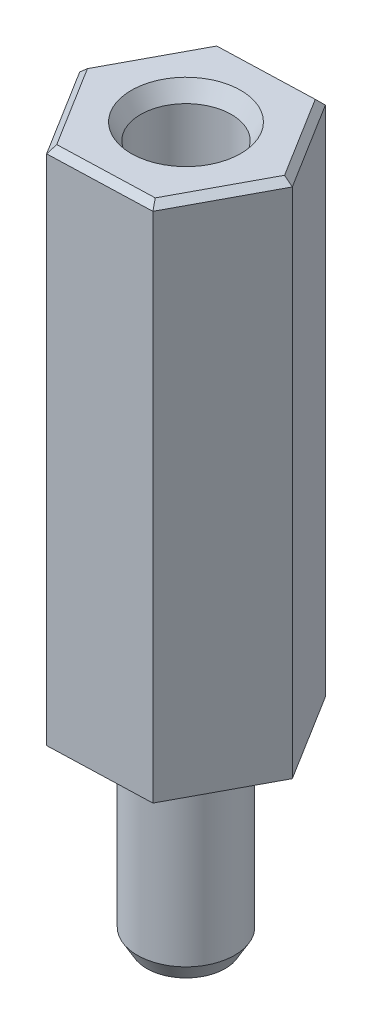
ISO-10303-21;
HEADER;
FILE_DESCRIPTION(('STEP AP214'),'2;1');
FILE_NAME('part.step','',(''),(''),'','','');
FILE_SCHEMA(('AUTOMOTIVE_DESIGN { 1 0 10303 214 1 1 1 1 }'));
ENDSEC;
DATA;
#1=APPLICATION_CONTEXT('core data for automotive mechanical design processes');
#2=APPLICATION_PROTOCOL_DEFINITION('international standard','automotive_design',2000,#1);
#3=PRODUCT_CONTEXT('',#1,'mechanical');
#4=PRODUCT('Part','Part','',(#3));
#5=PRODUCT_RELATED_PRODUCT_CATEGORY('part','',(#4));
#6=PRODUCT_DEFINITION_FORMATION('','',#4);
#7=PRODUCT_DEFINITION_CONTEXT('part definition',#1,'design');
#8=PRODUCT_DEFINITION('design','',#6,#7);
#9=PRODUCT_DEFINITION_SHAPE('','',#8);
#10=(LENGTH_UNIT() NAMED_UNIT(*) SI_UNIT(.MILLI.,.METRE.));
#11=(NAMED_UNIT(*) PLANE_ANGLE_UNIT() SI_UNIT($,.RADIAN.));
#12=(NAMED_UNIT(*) SI_UNIT($,.STERADIAN.) SOLID_ANGLE_UNIT());
#13=UNCERTAINTY_MEASURE_WITH_UNIT(LENGTH_MEASURE(1.E-05),#10,'distance_accuracy_value','');
#14=(GEOMETRIC_REPRESENTATION_CONTEXT(3) GLOBAL_UNCERTAINTY_ASSIGNED_CONTEXT((#13)) GLOBAL_UNIT_ASSIGNED_CONTEXT((#10,
#11,#12)) REPRESENTATION_CONTEXT('',''));
#15=CARTESIAN_POINT('',(0.,0.,0.));
#16=DIRECTION('',(0.,0.,1.));
#17=DIRECTION('',(1.,0.,0.));
#18=AXIS2_PLACEMENT_3D('',#15,#16,#17);
#19=CARTESIAN_POINT('',(3.17374881746763,16.,-0.103207446224368));
#20=DIRECTION('',(-0.849316901074805,0.,0.527883321908062));
#21=DIRECTION('',(0.527883321908062,0.,0.849316901074805));
#22=AXIS2_PLACEMENT_3D('',#19,#20,#21);
#23=PLANE('',#22);
#24=DIRECTION('',(0.,-1.,0.));
#25=VECTOR('',#24,1.);
#26=CARTESIAN_POINT('',(1.4974941384438,16.,-2.80015082426997));
#27=LINE('',#26,#25);
#28=CARTESIAN_POINT('',(1.4974941384438,15.8,-2.80015082426997));
#29=VERTEX_POINT('',#28);
#30=CARTESIAN_POINT('',(1.4974941384438,0.,-2.80015082426997));
#31=VERTEX_POINT('',#30);
#32=EDGE_CURVE('E117',#29,#31,#27,.T.);
#33=ORIENTED_EDGE('',*,*,#32,.F.);
#34=DIRECTION('',(0.527883321908062,0.,0.849316901074805));
#35=VECTOR('',#34,1.);
#36=CARTESIAN_POINT('',(3.17374881746763,15.8,-0.103207446224368));
#37=LINE('',#36,#35);
#38=CARTESIAN_POINT('',(3.17374881746763,15.8,-0.103207446224368));
#39=VERTEX_POINT('',#38);
#40=EDGE_CURVE('E191',#29,#39,#37,.T.);
#41=ORIENTED_EDGE('',*,*,#40,.T.);
#42=DIRECTION('',(0.,-1.,0.));
#43=VECTOR('',#42,1.);
#44=CARTESIAN_POINT('',(3.17374881746763,16.,-0.103207446224368));
#45=LINE('',#44,#43);
#46=CARTESIAN_POINT('',(3.17374881746763,0.,-0.103207446224368));
#47=VERTEX_POINT('',#46);
#48=EDGE_CURVE('E141',#39,#47,#45,.T.);
#49=ORIENTED_EDGE('',*,*,#48,.T.);
#50=DIRECTION('',(-0.527883321908062,0.,-0.849316901074805));
#51=VECTOR('',#50,1.);
#52=CARTESIAN_POINT('',(3.17374881746763,0.,-0.103207446224368));
#53=LINE('',#52,#51);
#54=EDGE_CURVE('E136',#47,#31,#53,.T.);
#55=ORIENTED_EDGE('',*,*,#54,.T.);
#56=EDGE_LOOP('',(#33,#41,#49,#55));
#57=FACE_BOUND('',#56,.T.);
#58=ADVANCED_FACE('F46',(#57),#23,.F.);
#59=CARTESIAN_POINT('',(1.4974941384438,16.,-2.80015082426997));
#60=DIRECTION('',(0.0325019164690975,0.,0.999471673148287));
#61=DIRECTION('',(0.999471673148287,0.,-0.0325019164690975));
#62=AXIS2_PLACEMENT_3D('',#59,#60,#61);
#63=PLANE('',#62);
#64=DIRECTION('',(0.,-1.,0.));
#65=VECTOR('',#64,1.);
#66=CARTESIAN_POINT('',(-1.67625467902383,16.,-2.69694337804561));
#67=LINE('',#66,#65);
#68=CARTESIAN_POINT('',(-1.67625467902383,15.8,-2.69694337804561));
#69=VERTEX_POINT('',#68);
#70=CARTESIAN_POINT('',(-1.67625467902383,0.,-2.69694337804561));
#71=VERTEX_POINT('',#70);
#72=EDGE_CURVE('E130',#69,#71,#67,.T.);
#73=ORIENTED_EDGE('',*,*,#72,.F.);
#74=DIRECTION('',(0.999471673148287,0.,-0.0325019164690975));
#75=VECTOR('',#74,1.);
#76=CARTESIAN_POINT('',(1.4974941384438,15.8,-2.80015082426997));
#77=LINE('',#76,#75);
#78=EDGE_CURVE('E124',#69,#29,#77,.T.);
#79=ORIENTED_EDGE('',*,*,#78,.T.);
#80=ORIENTED_EDGE('',*,*,#32,.T.);
#81=DIRECTION('',(-0.999471673148287,0.,0.0325019164690975));
#82=VECTOR('',#81,1.);
#83=CARTESIAN_POINT('',(1.4974941384438,0.,-2.80015082426997));
#84=LINE('',#83,#82);
#85=EDGE_CURVE('E121',#31,#71,#84,.T.);
#86=ORIENTED_EDGE('',*,*,#85,.T.);
#87=EDGE_LOOP('',(#73,#79,#80,#86));
#88=FACE_BOUND('',#87,.T.);
#89=ADVANCED_FACE('F120',(#88),#63,.F.);
#90=CARTESIAN_POINT('',(-1.67625467902383,16.,-2.69694337804561));
#91=DIRECTION('',(0.881818817543902,0.,0.471588351240225));
#92=DIRECTION('',(0.471588351240225,0.,-0.881818817543902));
#93=AXIS2_PLACEMENT_3D('',#90,#91,#92);
#94=PLANE('',#93);
#95=DIRECTION('',(0.,-1.,0.));
#96=VECTOR('',#95,1.);
#97=CARTESIAN_POINT('',(-3.17374881746763,16.,0.103207446224368));
#98=LINE('',#97,#96);
#99=CARTESIAN_POINT('',(-3.17374881746763,15.8,0.103207446224368));
#100=VERTEX_POINT('',#99);
#101=CARTESIAN_POINT('',(-3.17374881746763,0.,0.103207446224368));
#102=VERTEX_POINT('',#101);
#103=EDGE_CURVE('E163',#100,#102,#98,.T.);
#104=ORIENTED_EDGE('',*,*,#103,.F.);
#105=DIRECTION('',(0.471588351240225,0.,-0.881818817543902));
#106=VECTOR('',#105,1.);
#107=CARTESIAN_POINT('',(-1.67625467902383,15.8,-2.69694337804561));
#108=LINE('',#107,#106);
#109=EDGE_CURVE('E194',#100,#69,#108,.T.);
#110=ORIENTED_EDGE('',*,*,#109,.T.);
#111=ORIENTED_EDGE('',*,*,#72,.T.);
#112=DIRECTION('',(-0.471588351240225,0.,0.881818817543902));
#113=VECTOR('',#112,1.);
#114=CARTESIAN_POINT('',(-1.67625467902383,0.,-2.69694337804561));
#115=LINE('',#114,#113);
#116=EDGE_CURVE('E139',#71,#102,#115,.T.);
#117=ORIENTED_EDGE('',*,*,#116,.T.);
#118=EDGE_LOOP('',(#104,#110,#111,#117));
#119=FACE_BOUND('',#118,.T.);
#120=ADVANCED_FACE('F227',(#119),#94,.F.);
#121=CARTESIAN_POINT('',(-3.17374881746763,16.,0.103207446224368));
#122=DIRECTION('',(0.849316901074805,0.,-0.527883321908062));
#123=DIRECTION('',(-0.527883321908062,0.,-0.849316901074805));
#124=AXIS2_PLACEMENT_3D('',#121,#122,#123);
#125=PLANE('',#124);
#126=DIRECTION('',(0.,-1.,0.));
#127=VECTOR('',#126,1.);
#128=CARTESIAN_POINT('',(-1.49749413844379,16.,2.80015082426997));
#129=LINE('',#128,#127);
#130=CARTESIAN_POINT('',(-1.49749413844379,15.8,2.80015082426997));
#131=VERTEX_POINT('',#130);
#132=CARTESIAN_POINT('',(-1.49749413844379,0.,2.80015082426997));
#133=VERTEX_POINT('',#132);
#134=EDGE_CURVE('E161',#131,#133,#129,.T.);
#135=ORIENTED_EDGE('',*,*,#134,.F.);
#136=DIRECTION('',(-0.527883321908062,0.,-0.849316901074805));
#137=VECTOR('',#136,1.);
#138=CARTESIAN_POINT('',(-3.17374881746763,15.8,0.103207446224368));
#139=LINE('',#138,#137);
#140=EDGE_CURVE('E196',#131,#100,#139,.T.);
#141=ORIENTED_EDGE('',*,*,#140,.T.);
#142=ORIENTED_EDGE('',*,*,#103,.T.);
#143=DIRECTION('',(0.527883321908062,0.,0.849316901074805));
#144=VECTOR('',#143,1.);
#145=CARTESIAN_POINT('',(-3.17374881746763,0.,0.103207446224368));
#146=LINE('',#145,#144);
#147=EDGE_CURVE('E150',#102,#133,#146,.T.);
#148=ORIENTED_EDGE('',*,*,#147,.T.);
#149=EDGE_LOOP('',(#135,#141,#142,#148));
#150=FACE_BOUND('',#149,.T.);
#151=ADVANCED_FACE('F225',(#150),#125,.F.);
#152=CARTESIAN_POINT('',(-1.49749413844379,16.,2.80015082426997));
#153=DIRECTION('',(-0.0325019164690977,0.,-0.999471673148287));
#154=DIRECTION('',(-0.999471673148287,0.,0.0325019164690977));
#155=AXIS2_PLACEMENT_3D('',#152,#153,#154);
#156=PLANE('',#155);
#157=DIRECTION('',(0.,-1.,0.));
#158=VECTOR('',#157,1.);
#159=CARTESIAN_POINT('',(1.67625467902383,16.,2.69694337804561));
#160=LINE('',#159,#158);
#161=CARTESIAN_POINT('',(1.67625467902383,15.8,2.69694337804561));
#162=VERTEX_POINT('',#161);
#163=CARTESIAN_POINT('',(1.67625467902383,0.,2.69694337804561));
#164=VERTEX_POINT('',#163);
#165=EDGE_CURVE('E159',#162,#164,#160,.T.);
#166=ORIENTED_EDGE('',*,*,#165,.F.);
#167=DIRECTION('',(-0.999471673148287,0.,0.0325019164690977));
#168=VECTOR('',#167,1.);
#169=CARTESIAN_POINT('',(-1.49749413844379,15.8,2.80015082426997));
#170=LINE('',#169,#168);
#171=EDGE_CURVE('E55',#162,#131,#170,.T.);
#172=ORIENTED_EDGE('',*,*,#171,.T.);
#173=ORIENTED_EDGE('',*,*,#134,.T.);
#174=DIRECTION('',(0.999471673148287,0.,-0.0325019164690977));
#175=VECTOR('',#174,1.);
#176=CARTESIAN_POINT('',(-1.49749413844379,0.,2.80015082426997));
#177=LINE('',#176,#175);
#178=EDGE_CURVE('E153',#133,#164,#177,.T.);
#179=ORIENTED_EDGE('',*,*,#178,.T.);
#180=EDGE_LOOP('',(#166,#172,#173,#179));
#181=FACE_BOUND('',#180,.T.);
#182=ADVANCED_FACE('F229',(#181),#156,.F.);
#183=CARTESIAN_POINT('',(1.67625467902383,16.,2.69694337804561));
#184=DIRECTION('',(-0.881818817543902,0.,-0.471588351240225));
#185=DIRECTION('',(-0.471588351240225,0.,0.881818817543902));
#186=AXIS2_PLACEMENT_3D('',#183,#184,#185);
#187=PLANE('',#186);
#188=ORIENTED_EDGE('',*,*,#48,.F.);
#189=DIRECTION('',(-0.471588351240225,0.,0.881818817543902));
#190=VECTOR('',#189,1.);
#191=CARTESIAN_POINT('',(1.67625467902383,15.8,2.69694337804561));
#192=LINE('',#191,#190);
#193=EDGE_CURVE('E13',#39,#162,#192,.T.);
#194=ORIENTED_EDGE('',*,*,#193,.T.);
#195=ORIENTED_EDGE('',*,*,#165,.T.);
#196=DIRECTION('',(0.471588351240225,0.,-0.881818817543902));
#197=VECTOR('',#196,1.);
#198=CARTESIAN_POINT('',(1.67625467902383,0.,2.69694337804561));
#199=LINE('',#198,#197);
#200=EDGE_CURVE('E156',#164,#47,#199,.T.);
#201=ORIENTED_EDGE('',*,*,#200,.T.);
#202=EDGE_LOOP('',(#188,#194,#195,#201));
#203=FACE_BOUND('',#202,.T.);
#204=ADVANCED_FACE('F230',(#203),#187,.F.);
#205=CARTESIAN_POINT('',(0.,16.,0.));
#206=DIRECTION('',(0.,1.,0.));
#207=DIRECTION('',(0.,0.,1.));
#208=AXIS2_PLACEMENT_3D('',#205,#206,#207);
#209=PLANE('',#208);
#210=DIRECTION('',(0.471588351240225,0.,-0.881818817543902));
#211=VECTOR('',#210,1.);
#212=CARTESIAN_POINT('',(2.99738505395885,16.,-0.197525116472412));
#213=LINE('',#212,#211);
#214=CARTESIAN_POINT('',(1.5543452478221,16.,2.50080204146047));
#215=VERTEX_POINT('',#214);
#216=CARTESIAN_POINT('',(2.9429307216518,16.,-0.095701450135322));
#217=VERTEX_POINT('',#216);
#218=EDGE_CURVE('E178',#215,#217,#213,.T.);
#219=ORIENTED_EDGE('',*,*,#218,.T.);
#220=DIRECTION('',(-0.527883321908062,0.,-0.849316901074805));
#221=VECTOR('',#220,1.);
#222=CARTESIAN_POINT('',(1.32763075822884,16.,-2.69457415988836));
#223=LINE('',#222,#221);
#224=CARTESIAN_POINT('',(1.3885854738297,16.,-2.59650349159579));
#225=VERTEX_POINT('',#224);
#226=EDGE_CURVE('E188',#217,#225,#223,.T.);
#227=ORIENTED_EDGE('',*,*,#226,.T.);
#228=DIRECTION('',(-0.999471673148287,0.,0.0325019164690975));
#229=VECTOR('',#228,1.);
#230=CARTESIAN_POINT('',(-1.66975429573001,16.,-2.49704904341595));
#231=LINE('',#230,#229);
#232=CARTESIAN_POINT('',(-1.5543452478221,16.,-2.50080204146047));
#233=VERTEX_POINT('',#232);
#234=EDGE_CURVE('E186',#225,#233,#231,.T.);
#235=ORIENTED_EDGE('',*,*,#234,.T.);
#236=DIRECTION('',(-0.471588351240225,0.,0.881818817543903));
#237=VECTOR('',#236,1.);
#238=CARTESIAN_POINT('',(-2.99738505395885,16.,0.197525116472412));
#239=LINE('',#238,#237);
#240=CARTESIAN_POINT('',(-2.9429307216518,16.,0.095701450135323));
#241=VERTEX_POINT('',#240);
#242=EDGE_CURVE('E184',#233,#241,#239,.T.);
#243=ORIENTED_EDGE('',*,*,#242,.T.);
#244=DIRECTION('',(0.527883321908062,0.,0.849316901074805));
#245=VECTOR('',#244,1.);
#246=CARTESIAN_POINT('',(-1.32763075822884,16.,2.69457415988836));
#247=LINE('',#246,#245);
#248=CARTESIAN_POINT('',(-1.3885854738297,16.,2.59650349159579));
#249=VERTEX_POINT('',#248);
#250=EDGE_CURVE('E182',#241,#249,#247,.T.);
#251=ORIENTED_EDGE('',*,*,#250,.T.);
#252=DIRECTION('',(0.999471673148287,0.,-0.0325019164690977));
#253=VECTOR('',#252,1.);
#254=CARTESIAN_POINT('',(1.66975429573001,16.,2.49704904341595));
#255=LINE('',#254,#253);
#256=EDGE_CURVE('E180',#249,#215,#255,.T.);
#257=ORIENTED_EDGE('',*,*,#256,.T.);
#258=EDGE_LOOP('',(#219,#227,#235,#243,#251,#257));
#259=FACE_BOUND('',#258,.T.);
#260=CARTESIAN_POINT('',(0.,16.,0.));
#261=DIRECTION('',(0.,1.,0.));
#262=DIRECTION('',(0.,0.,1.));
#263=AXIS2_PLACEMENT_3D('',#260,#261,#262);
#264=CIRCLE('',#263,1.68867513459481);
#265=CARTESIAN_POINT('',(0.,16.,1.68867513459481));
#266=VERTEX_POINT('',#265);
#267=EDGE_CURVE('E169',#266,#266,#264,.F.);
#268=ORIENTED_EDGE('',*,*,#267,.T.);
#269=EDGE_LOOP('',(#268));
#270=FACE_BOUND('',#269,.T.);
#271=ADVANCED_FACE('F232',(#259,#270),#209,.T.);
#272=CARTESIAN_POINT('',(0.,0.,0.));
#273=DIRECTION('',(0.,1.,0.));
#274=DIRECTION('',(0.,0.,1.));
#275=AXIS2_PLACEMENT_3D('',#272,#273,#274);
#276=PLANE('',#275);
#277=CARTESIAN_POINT('',(0.,0.,0.));
#278=DIRECTION('',(0.,-1.,0.));
#279=DIRECTION('',(0.,0.,-1.));
#280=AXIS2_PLACEMENT_3D('',#277,#278,#279);
#281=CIRCLE('',#280,1.5);
#282=CARTESIAN_POINT('',(0.,0.,-1.5));
#283=VERTEX_POINT('',#282);
#284=EDGE_CURVE('E129',#283,#283,#281,.T.);
#285=ORIENTED_EDGE('',*,*,#284,.F.);
#286=EDGE_LOOP('',(#285));
#287=FACE_BOUND('',#286,.T.);
#288=ORIENTED_EDGE('',*,*,#54,.F.);
#289=ORIENTED_EDGE('',*,*,#200,.F.);
#290=ORIENTED_EDGE('',*,*,#178,.F.);
#291=ORIENTED_EDGE('',*,*,#147,.F.);
#292=ORIENTED_EDGE('',*,*,#116,.F.);
#293=ORIENTED_EDGE('',*,*,#85,.F.);
#294=EDGE_LOOP('',(#288,#289,#290,#291,#292,#293));
#295=FACE_BOUND('',#294,.T.);
#296=ADVANCED_FACE('F134',(#287,#295),#276,.F.);
#297=CARTESIAN_POINT('',(0.,6.,0.));
#298=DIRECTION('',(0.,1.,0.));
#299=DIRECTION('',(0.,0.,1.));
#300=AXIS2_PLACEMENT_3D('',#297,#298,#299);
#301=CYLINDRICAL_SURFACE('',#300,1.4);
#302=CARTESIAN_POINT('',(0.,15.5,0.));
#303=DIRECTION('',(0.,1.,0.));
#304=DIRECTION('',(0.,0.,1.));
#305=AXIS2_PLACEMENT_3D('',#302,#303,#304);
#306=CIRCLE('',#305,1.4);
#307=CARTESIAN_POINT('',(0.,15.5,1.4));
#308=VERTEX_POINT('',#307);
#309=EDGE_CURVE('E166',#308,#308,#306,.T.);
#310=ORIENTED_EDGE('',*,*,#309,.T.);
#311=EDGE_LOOP('',(#310));
#312=FACE_BOUND('',#311,.T.);
#313=CARTESIAN_POINT('',(0.,6.,0.));
#314=DIRECTION('',(0.,1.,0.));
#315=DIRECTION('',(0.,0.,1.));
#316=AXIS2_PLACEMENT_3D('',#313,#314,#315);
#317=CIRCLE('',#316,1.4);
#318=CARTESIAN_POINT('',(0.,6.,1.4));
#319=VERTEX_POINT('',#318);
#320=EDGE_CURVE('E143',#319,#319,#317,.T.);
#321=ORIENTED_EDGE('',*,*,#320,.F.);
#322=EDGE_LOOP('',(#321));
#323=FACE_BOUND('',#322,.T.);
#324=ADVANCED_FACE('F311',(#312,#323),#301,.F.);
#325=CARTESIAN_POINT('',(0.,6.,0.));
#326=DIRECTION('',(0.,1.,0.));
#327=DIRECTION('',(0.,0.,1.));
#328=AXIS2_PLACEMENT_3D('',#325,#326,#327);
#329=PLANE('',#328);
#330=ORIENTED_EDGE('',*,*,#320,.T.);
#331=EDGE_LOOP('',(#330));
#332=FACE_BOUND('',#331,.T.);
#333=ADVANCED_FACE('F302',(#332),#329,.T.);
#334=CARTESIAN_POINT('',(0.,-6.,0.));
#335=DIRECTION('',(0.,1.,0.));
#336=DIRECTION('',(0.,0.,1.));
#337=AXIS2_PLACEMENT_3D('',#334,#335,#336);
#338=CYLINDRICAL_SURFACE('',#337,1.5);
#339=CARTESIAN_POINT('',(0.,-5.49999999999999,0.));
#340=DIRECTION('',(0.,-1.,0.));
#341=DIRECTION('',(0.,0.,-1.));
#342=AXIS2_PLACEMENT_3D('',#339,#340,#341);
#343=CIRCLE('',#342,1.5);
#344=CARTESIAN_POINT('',(0.,-5.49999999999999,-1.5));
#345=VERTEX_POINT('',#344);
#346=EDGE_CURVE('E175',#345,#345,#343,.F.);
#347=ORIENTED_EDGE('',*,*,#346,.T.);
#348=EDGE_LOOP('',(#347));
#349=FACE_BOUND('',#348,.T.);
#350=ORIENTED_EDGE('',*,*,#284,.T.);
#351=EDGE_LOOP('',(#350));
#352=FACE_BOUND('',#351,.T.);
#353=ADVANCED_FACE('F294',(#349,#352),#338,.T.);
#354=CARTESIAN_POINT('',(0.,-6.,0.));
#355=DIRECTION('',(0.,-1.,0.));
#356=DIRECTION('',(0.,0.,-1.));
#357=AXIS2_PLACEMENT_3D('',#354,#355,#356);
#358=PLANE('',#357);
#359=CARTESIAN_POINT('',(0.,-6.,0.));
#360=DIRECTION('',(0.,-1.,0.));
#361=DIRECTION('',(0.,0.,-1.));
#362=AXIS2_PLACEMENT_3D('',#359,#360,#361);
#363=CIRCLE('',#362,1.21132486540519);
#364=CARTESIAN_POINT('',(0.,-6.,-1.21132486540519));
#365=VERTEX_POINT('',#364);
#366=EDGE_CURVE('E172',#365,#365,#363,.T.);
#367=ORIENTED_EDGE('',*,*,#366,.T.);
#368=EDGE_LOOP('',(#367));
#369=FACE_BOUND('',#368,.T.);
#370=ADVANCED_FACE('F254',(#369),#358,.T.);
#371=CARTESIAN_POINT('',(0.,15.5,0.));
#372=DIRECTION('',(0.,1.,0.));
#373=DIRECTION('',(0.,0.,1.));
#374=AXIS2_PLACEMENT_3D('',#371,#372,#373);
#375=CONICAL_SURFACE('',#374,1.4,0.523598775598297);
#376=ORIENTED_EDGE('',*,*,#267,.F.);
#377=EDGE_LOOP('',(#376));
#378=FACE_BOUND('',#377,.T.);
#379=ORIENTED_EDGE('',*,*,#309,.F.);
#380=EDGE_LOOP('',(#379));
#381=FACE_BOUND('',#380,.T.);
#382=ADVANCED_FACE('F250',(#378,#381),#375,.F.);
#383=CARTESIAN_POINT('',(0.,-6.,0.));
#384=DIRECTION('',(0.,1.,0.));
#385=DIRECTION('',(0.,0.,1.));
#386=AXIS2_PLACEMENT_3D('',#383,#384,#385);
#387=CONICAL_SURFACE('',#386,1.21132486540519,0.523598775598295);
#388=ORIENTED_EDGE('',*,*,#346,.F.);
#389=EDGE_LOOP('',(#388));
#390=FACE_BOUND('',#389,.T.);
#391=ORIENTED_EDGE('',*,*,#366,.F.);
#392=EDGE_LOOP('',(#391));
#393=FACE_BOUND('',#392,.T.);
#394=ADVANCED_FACE('F253',(#390,#393),#387,.T.);
#395=CARTESIAN_POINT('',(-2.16575809774075,16.,1.34610247086556));
#396=DIRECTION('',(-0.600557740126344,0.70710678118654,0.373269876596475));
#397=DIRECTION('',(-0.527883321908062,0.,-0.849316901074805));
#398=AXIS2_PLACEMENT_3D('',#395,#396,#397);
#399=PLANE('',#398);
#400=DIRECTION('',(-0.755529568458279,-0.654653670707984,0.0245691394600639));
#401=VECTOR('',#400,1.);
#402=CARTESIAN_POINT('',(-2.52251204713012,16.3642857142857,0.0820298144017062));
#403=LINE('',#402,#401);
#404=EDGE_CURVE('E208',#100,#241,#403,.F.);
#405=ORIENTED_EDGE('',*,*,#404,.F.);
#406=ORIENTED_EDGE('',*,*,#140,.F.);
#407=DIRECTION('',(-0.356487285307599,-0.654653670707984,0.666592369325198));
#408=VECTOR('',#407,1.);
#409=CARTESIAN_POINT('',(-1.19021612042546,16.3642857142857,2.22557442136783));
#410=LINE('',#409,#408);
#411=EDGE_CURVE('E50',#249,#131,#410,.T.);
#412=ORIENTED_EDGE('',*,*,#411,.F.);
#413=ORIENTED_EDGE('',*,*,#250,.F.);
#414=EDGE_LOOP('',(#405,#406,#412,#413));
#415=FACE_BOUND('',#414,.T.);
#416=ADVANCED_FACE('F48',(#415),#399,.T.);
#417=CARTESIAN_POINT('',(0.0828798869961992,16.,2.54865276652813));
#418=DIRECTION('',(0.0229823255368579,0.707106781186542,0.706733197687024));
#419=DIRECTION('',(-0.999471673148287,0.,0.0325019164690977));
#420=AXIS2_PLACEMENT_3D('',#417,#418,#419);
#421=PLANE('',#420);
#422=ORIENTED_EDGE('',*,*,#411,.T.);
#423=ORIENTED_EDGE('',*,*,#171,.F.);
#424=DIRECTION('',(0.399042283150678,-0.654653670707984,0.642023229865133));
#425=VECTOR('',#424,1.);
#426=CARTESIAN_POINT('',(1.33229592670466,16.3642857142857,2.14354460696612));
#427=LINE('',#426,#425);
#428=EDGE_CURVE('E206',#215,#162,#427,.T.);
#429=ORIENTED_EDGE('',*,*,#428,.F.);
#430=ORIENTED_EDGE('',*,*,#256,.F.);
#431=EDGE_LOOP('',(#422,#423,#429,#430));
#432=FACE_BOUND('',#431,.T.);
#433=ADVANCED_FACE('F218',(#432),#421,.T.);
#434=CARTESIAN_POINT('',(-2.24863798473695,16.,-1.20255029566257));
#435=DIRECTION('',(-0.623540065663202,0.707106781186541,-0.33346332109055));
#436=DIRECTION('',(0.471588351240225,0.,-0.881818817543902));
#437=AXIS2_PLACEMENT_3D('',#434,#435,#436);
#438=PLANE('',#437);
#439=ORIENTED_EDGE('',*,*,#404,.T.);
#440=ORIENTED_EDGE('',*,*,#242,.F.);
#441=DIRECTION('',(-0.399042283150678,-0.654653670707984,-0.642023229865132));
#442=VECTOR('',#441,1.);
#443=CARTESIAN_POINT('',(-1.33229592670466,16.3642857142857,-2.14354460696612));
#444=LINE('',#443,#442);
#445=EDGE_CURVE('E203',#69,#233,#444,.F.);
#446=ORIENTED_EDGE('',*,*,#445,.F.);
#447=ORIENTED_EDGE('',*,*,#109,.F.);
#448=EDGE_LOOP('',(#439,#440,#446,#447));
#449=FACE_BOUND('',#448,.T.);
#450=ADVANCED_FACE('F270',(#449),#438,.T.);
#451=CARTESIAN_POINT('',(2.24863798473695,16.,1.20255029566257));
#452=DIRECTION('',(0.623540065663202,0.707106781186541,0.33346332109055));
#453=DIRECTION('',(-0.471588351240225,0.,0.881818817543902));
#454=AXIS2_PLACEMENT_3D('',#451,#452,#453);
#455=PLANE('',#454);
#456=ORIENTED_EDGE('',*,*,#428,.T.);
#457=ORIENTED_EDGE('',*,*,#193,.F.);
#458=DIRECTION('',(-0.75552956845828,0.654653670707984,0.0245691394600663));
#459=VECTOR('',#458,1.);
#460=CARTESIAN_POINT('',(2.52251204713012,16.3642857142857,-0.082029814401704));
#461=LINE('',#460,#459);
#462=EDGE_CURVE('E201',#217,#39,#461,.F.);
#463=ORIENTED_EDGE('',*,*,#462,.F.);
#464=ORIENTED_EDGE('',*,*,#218,.F.);
#465=EDGE_LOOP('',(#456,#457,#463,#464));
#466=FACE_BOUND('',#465,.T.);
#467=ADVANCED_FACE('F266',(#466),#455,.T.);
#468=CARTESIAN_POINT('',(-0.0828798869961988,16.,-2.54865276652813));
#469=DIRECTION('',(-0.0229823255368578,0.707106781186541,-0.706733197687024));
#470=DIRECTION('',(0.999471673148287,0.,-0.0325019164690975));
#471=AXIS2_PLACEMENT_3D('',#468,#469,#470);
#472=PLANE('',#471);
#473=ORIENTED_EDGE('',*,*,#445,.T.);
#474=ORIENTED_EDGE('',*,*,#234,.F.);
#475=DIRECTION('',(0.356487285307602,-0.654653670707983,-0.666592369325197));
#476=VECTOR('',#475,1.);
#477=CARTESIAN_POINT('',(1.19021612042546,16.3642857142857,-2.22557442136783));
#478=LINE('',#477,#476);
#479=EDGE_CURVE('E199',#29,#225,#478,.F.);
#480=ORIENTED_EDGE('',*,*,#479,.F.);
#481=ORIENTED_EDGE('',*,*,#78,.F.);
#482=EDGE_LOOP('',(#473,#474,#480,#481));
#483=FACE_BOUND('',#482,.T.);
#484=ADVANCED_FACE('F262',(#483),#472,.T.);
#485=CARTESIAN_POINT('',(2.16575809774075,16.,-1.34610247086556));
#486=DIRECTION('',(0.600557740126343,0.707106781186542,-0.373269876596475));
#487=DIRECTION('',(0.527883321908062,0.,0.849316901074805));
#488=AXIS2_PLACEMENT_3D('',#485,#486,#487);
#489=PLANE('',#488);
#490=ORIENTED_EDGE('',*,*,#462,.T.);
#491=ORIENTED_EDGE('',*,*,#40,.F.);
#492=ORIENTED_EDGE('',*,*,#479,.T.);
#493=ORIENTED_EDGE('',*,*,#226,.F.);
#494=EDGE_LOOP('',(#490,#491,#492,#493));
#495=FACE_BOUND('',#494,.T.);
#496=ADVANCED_FACE('F259',(#495),#489,.T.);
#497=CLOSED_SHELL('',(#58,#89,#120,#151,#182,#204,#271,#296,#324,#333,#353,#370,#382,#394,#416,
#433,#450,#467,#484,#496));
#498=MANIFOLD_SOLID_BREP('B2',#497);
#499=ADVANCED_BREP_SHAPE_REPRESENTATION('',(#18,#498),#14);
#500=SHAPE_DEFINITION_REPRESENTATION(#9,#499);
ENDSEC;
END-ISO-10303-21;
